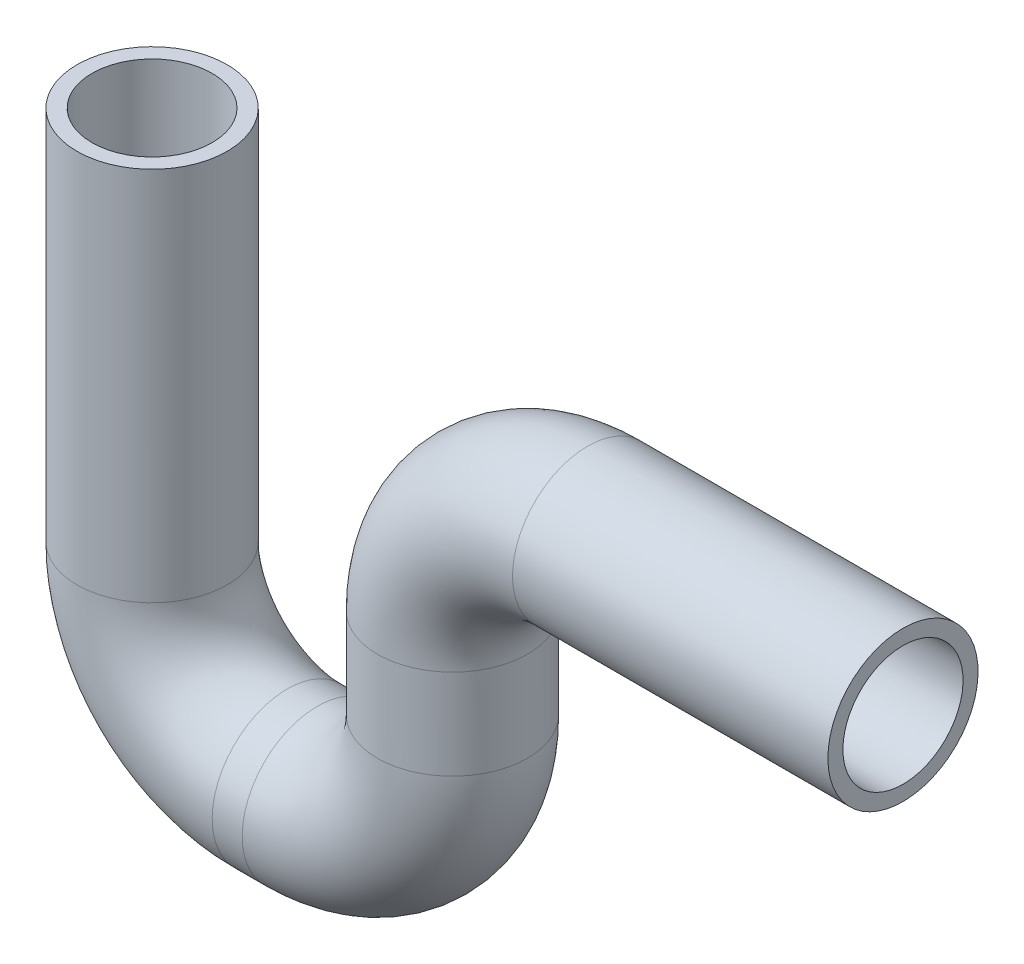
ISO-10303-21;
HEADER;
FILE_DESCRIPTION(('STEP AP214'),'2;1');
FILE_NAME('part.step','',(''),(''),'','','');
FILE_SCHEMA(('AUTOMOTIVE_DESIGN { 1 0 10303 214 1 1 1 1 }'));
ENDSEC;
DATA;
#1=APPLICATION_CONTEXT('core data for automotive mechanical design processes');
#2=APPLICATION_PROTOCOL_DEFINITION('international standard','automotive_design',2000,#1);
#3=PRODUCT_CONTEXT('',#1,'mechanical');
#4=PRODUCT('Part','Part','',(#3));
#5=PRODUCT_RELATED_PRODUCT_CATEGORY('part','',(#4));
#6=PRODUCT_DEFINITION_FORMATION('','',#4);
#7=PRODUCT_DEFINITION_CONTEXT('part definition',#1,'design');
#8=PRODUCT_DEFINITION('design','',#6,#7);
#9=PRODUCT_DEFINITION_SHAPE('','',#8);
#10=(LENGTH_UNIT() NAMED_UNIT(*) SI_UNIT(.MILLI.,.METRE.));
#11=(NAMED_UNIT(*) PLANE_ANGLE_UNIT() SI_UNIT($,.RADIAN.));
#12=(NAMED_UNIT(*) SI_UNIT($,.STERADIAN.) SOLID_ANGLE_UNIT());
#13=UNCERTAINTY_MEASURE_WITH_UNIT(LENGTH_MEASURE(1.E-05),#10,'distance_accuracy_value','');
#14=(GEOMETRIC_REPRESENTATION_CONTEXT(3) GLOBAL_UNCERTAINTY_ASSIGNED_CONTEXT((#13)) GLOBAL_UNIT_ASSIGNED_CONTEXT((#10,
#11,#12)) REPRESENTATION_CONTEXT('',''));
#15=CARTESIAN_POINT('',(0.,0.,0.));
#16=DIRECTION('',(0.,0.,1.));
#17=DIRECTION('',(1.,0.,0.));
#18=AXIS2_PLACEMENT_3D('',#15,#16,#17);
#19=CARTESIAN_POINT('',(0.,0.,0.));
#20=DIRECTION('',(0.,-1.,0.));
#21=DIRECTION('',(1.,0.,0.));
#22=AXIS2_PLACEMENT_3D('',#19,#20,#21);
#23=CYLINDRICAL_SURFACE('',#22,25.);
#24=CARTESIAN_POINT('',(0.,-125.,0.));
#25=DIRECTION('',(0.,1.,0.));
#26=DIRECTION('',(0.,0.,1.));
#27=AXIS2_PLACEMENT_3D('',#24,#25,#26);
#28=CIRCLE('',#27,25.);
#29=CARTESIAN_POINT('',(-25.,-125.,0.));
#30=VERTEX_POINT('',#29);
#31=EDGE_CURVE('E61',#30,#30,#28,.T.);
#32=ORIENTED_EDGE('',*,*,#31,.T.);
#33=EDGE_LOOP('',(#32));
#34=FACE_BOUND('',#33,.T.);
#35=CARTESIAN_POINT('',(0.,0.,0.));
#36=DIRECTION('',(0.,1.,0.));
#37=DIRECTION('',(0.,0.,1.));
#38=AXIS2_PLACEMENT_3D('',#35,#36,#37);
#39=CIRCLE('',#38,25.);
#40=CARTESIAN_POINT('',(0.,0.,25.));
#41=VERTEX_POINT('',#40);
#42=EDGE_CURVE('E58',#41,#41,#39,.T.);
#43=ORIENTED_EDGE('',*,*,#42,.F.);
#44=EDGE_LOOP('',(#43));
#45=FACE_BOUND('',#44,.T.);
#46=ADVANCED_FACE('F37',(#34,#45),#23,.T.);
#47=CARTESIAN_POINT('',(45.,-125.,0.));
#48=DIRECTION('',(0.,0.,1.));
#49=DIRECTION('',(1.,0.,0.));
#50=AXIS2_PLACEMENT_3D('',#47,#48,#49);
#51=TOROIDAL_SURFACE('',#50,45.,25.);
#52=CARTESIAN_POINT('',(45.,-170.,0.));
#53=DIRECTION('',(-1.,0.,0.));
#54=DIRECTION('',(0.,0.,1.));
#55=AXIS2_PLACEMENT_3D('',#52,#53,#54);
#56=CIRCLE('',#55,25.);
#57=CARTESIAN_POINT('',(45.,-195.,0.));
#58=VERTEX_POINT('',#57);
#59=EDGE_CURVE('E64',#58,#58,#56,.T.);
#60=CARTESIAN_POINT('',(45.,-125.,0.));
#61=DIRECTION('',(0.,0.,1.));
#62=DIRECTION('',(1.,0.,0.));
#63=AXIS2_PLACEMENT_3D('',#60,#61,#62);
#64=CIRCLE('',#63,70.);
#65=EDGE_CURVE('',#30,#58,#64,.T.);
#66=ORIENTED_EDGE('',*,*,#31,.F.);
#67=ORIENTED_EDGE('',*,*,#59,.T.);
#68=ORIENTED_EDGE('',*,*,#65,.T.);
#69=ORIENTED_EDGE('',*,*,#65,.F.);
#70=EDGE_LOOP('',(#66,#68,#67,#69));
#71=FACE_BOUND('',#70,.T.);
#72=ADVANCED_FACE('F112',(#71),#51,.T.);
#73=CARTESIAN_POINT('',(45.,-170.,0.));
#74=DIRECTION('',(1.,0.,0.));
#75=DIRECTION('',(0.,0.,-1.));
#76=AXIS2_PLACEMENT_3D('',#73,#74,#75);
#77=CYLINDRICAL_SURFACE('',#76,25.);
#78=CARTESIAN_POINT('',(55.,-170.,0.));
#79=DIRECTION('',(-1.,0.,0.));
#80=DIRECTION('',(0.,0.,1.));
#81=AXIS2_PLACEMENT_3D('',#78,#79,#80);
#82=CIRCLE('',#81,25.);
#83=CARTESIAN_POINT('',(55.,-195.,0.));
#84=VERTEX_POINT('',#83);
#85=EDGE_CURVE('E67',#84,#84,#82,.T.);
#86=ORIENTED_EDGE('',*,*,#85,.T.);
#87=EDGE_LOOP('',(#86));
#88=FACE_BOUND('',#87,.T.);
#89=ORIENTED_EDGE('',*,*,#59,.F.);
#90=EDGE_LOOP('',(#89));
#91=FACE_BOUND('',#90,.T.);
#92=ADVANCED_FACE('F116',(#88,#91),#77,.T.);
#93=CARTESIAN_POINT('',(55.,-125.,0.));
#94=DIRECTION('',(0.,0.,1.));
#95=DIRECTION('',(1.,0.,0.));
#96=AXIS2_PLACEMENT_3D('',#93,#94,#95);
#97=TOROIDAL_SURFACE('',#96,45.,25.);
#98=CARTESIAN_POINT('',(100.,-125.,0.));
#99=DIRECTION('',(0.,-1.,0.));
#100=DIRECTION('',(0.,0.,1.));
#101=AXIS2_PLACEMENT_3D('',#98,#99,#100);
#102=CIRCLE('',#101,25.);
#103=CARTESIAN_POINT('',(125.,-125.,0.));
#104=VERTEX_POINT('',#103);
#105=EDGE_CURVE('E70',#104,#104,#102,.T.);
#106=CARTESIAN_POINT('',(55.,-125.,0.));
#107=DIRECTION('',(0.,0.,1.));
#108=DIRECTION('',(1.,0.,0.));
#109=AXIS2_PLACEMENT_3D('',#106,#107,#108);
#110=CIRCLE('',#109,70.);
#111=EDGE_CURVE('',#84,#104,#110,.T.);
#112=ORIENTED_EDGE('',*,*,#85,.F.);
#113=ORIENTED_EDGE('',*,*,#105,.T.);
#114=ORIENTED_EDGE('',*,*,#111,.T.);
#115=ORIENTED_EDGE('',*,*,#111,.F.);
#116=EDGE_LOOP('',(#112,#114,#113,#115));
#117=FACE_BOUND('',#116,.T.);
#118=ADVANCED_FACE('F120',(#117),#97,.T.);
#119=CARTESIAN_POINT('',(100.,-125.,0.));
#120=DIRECTION('',(0.,1.,0.));
#121=DIRECTION('',(0.,0.,1.));
#122=AXIS2_PLACEMENT_3D('',#119,#120,#121);
#123=CYLINDRICAL_SURFACE('',#122,25.);
#124=CARTESIAN_POINT('',(100.,-95.,0.));
#125=DIRECTION('',(0.,-1.,0.));
#126=DIRECTION('',(0.,0.,1.));
#127=AXIS2_PLACEMENT_3D('',#124,#125,#126);
#128=CIRCLE('',#127,25.);
#129=CARTESIAN_POINT('',(75.,-95.,0.));
#130=VERTEX_POINT('',#129);
#131=EDGE_CURVE('E72',#130,#130,#128,.T.);
#132=ORIENTED_EDGE('',*,*,#131,.T.);
#133=EDGE_LOOP('',(#132));
#134=FACE_BOUND('',#133,.T.);
#135=ORIENTED_EDGE('',*,*,#105,.F.);
#136=EDGE_LOOP('',(#135));
#137=FACE_BOUND('',#136,.T.);
#138=ADVANCED_FACE('F92',(#134,#137),#123,.T.);
#139=CARTESIAN_POINT('',(145.,-95.,0.));
#140=DIRECTION('',(0.,0.,-1.));
#141=DIRECTION('',(-1.,0.,0.));
#142=AXIS2_PLACEMENT_3D('',#139,#140,#141);
#143=TOROIDAL_SURFACE('',#142,45.,25.);
#144=CARTESIAN_POINT('',(145.,-50.,0.));
#145=DIRECTION('',(-1.,0.,0.));
#146=DIRECTION('',(0.,0.,1.));
#147=AXIS2_PLACEMENT_3D('',#144,#145,#146);
#148=CIRCLE('',#147,25.);
#149=CARTESIAN_POINT('',(145.,-25.,0.));
#150=VERTEX_POINT('',#149);
#151=EDGE_CURVE('E41',#150,#150,#148,.T.);
#152=CARTESIAN_POINT('',(145.,-95.,0.));
#153=DIRECTION('',(0.,0.,-1.));
#154=DIRECTION('',(-1.,0.,0.));
#155=AXIS2_PLACEMENT_3D('',#152,#153,#154);
#156=CIRCLE('',#155,70.);
#157=EDGE_CURVE('',#130,#150,#156,.T.);
#158=ORIENTED_EDGE('',*,*,#131,.F.);
#159=ORIENTED_EDGE('',*,*,#151,.T.);
#160=ORIENTED_EDGE('',*,*,#157,.T.);
#161=ORIENTED_EDGE('',*,*,#157,.F.);
#162=EDGE_LOOP('',(#158,#160,#159,#161));
#163=FACE_BOUND('',#162,.T.);
#164=ADVANCED_FACE('F79',(#163),#143,.T.);
#165=CARTESIAN_POINT('',(145.,-50.,0.));
#166=DIRECTION('',(1.,0.,0.));
#167=DIRECTION('',(0.,0.,-1.));
#168=AXIS2_PLACEMENT_3D('',#165,#166,#167);
#169=CYLINDRICAL_SURFACE('',#168,25.);
#170=CARTESIAN_POINT('',(250.,-50.,0.));
#171=DIRECTION('',(-1.,0.,0.));
#172=DIRECTION('',(0.,0.,1.));
#173=AXIS2_PLACEMENT_3D('',#170,#171,#172);
#174=CIRCLE('',#173,25.);
#175=CARTESIAN_POINT('',(250.,-50.,25.));
#176=VERTEX_POINT('',#175);
#177=EDGE_CURVE('E54',#176,#176,#174,.T.);
#178=ORIENTED_EDGE('',*,*,#177,.T.);
#179=EDGE_LOOP('',(#178));
#180=FACE_BOUND('',#179,.T.);
#181=ORIENTED_EDGE('',*,*,#151,.F.);
#182=EDGE_LOOP('',(#181));
#183=FACE_BOUND('',#182,.T.);
#184=ADVANCED_FACE('F39',(#180,#183),#169,.T.);
#185=CARTESIAN_POINT('',(0.,0.,0.));
#186=DIRECTION('',(0.,1.,0.));
#187=DIRECTION('',(0.,0.,1.));
#188=AXIS2_PLACEMENT_3D('',#185,#186,#187);
#189=PLANE('',#188);
#190=CARTESIAN_POINT('',(0.,0.,0.));
#191=DIRECTION('',(0.,1.,0.));
#192=DIRECTION('',(0.,0.,1.));
#193=AXIS2_PLACEMENT_3D('',#190,#191,#192);
#194=CIRCLE('',#193,20.);
#195=CARTESIAN_POINT('',(0.,0.,20.));
#196=VERTEX_POINT('',#195);
#197=EDGE_CURVE('E57',#196,#196,#194,.F.);
#198=ORIENTED_EDGE('',*,*,#197,.T.);
#199=EDGE_LOOP('',(#198));
#200=FACE_BOUND('',#199,.T.);
#201=ORIENTED_EDGE('',*,*,#42,.T.);
#202=EDGE_LOOP('',(#201));
#203=FACE_BOUND('',#202,.T.);
#204=ADVANCED_FACE('F83',(#200,#203),#189,.T.);
#205=CARTESIAN_POINT('',(250.,-50.,0.));
#206=DIRECTION('',(-1.,0.,0.));
#207=DIRECTION('',(0.,0.,1.));
#208=AXIS2_PLACEMENT_3D('',#205,#206,#207);
#209=PLANE('',#208);
#210=CARTESIAN_POINT('',(250.,-50.,0.));
#211=DIRECTION('',(-1.,0.,0.));
#212=DIRECTION('',(0.,0.,1.));
#213=AXIS2_PLACEMENT_3D('',#210,#211,#212);
#214=CIRCLE('',#213,20.);
#215=CARTESIAN_POINT('',(250.,-50.,20.));
#216=VERTEX_POINT('',#215);
#217=EDGE_CURVE('E10',#216,#216,#214,.F.);
#218=ORIENTED_EDGE('',*,*,#217,.F.);
#219=EDGE_LOOP('',(#218));
#220=FACE_BOUND('',#219,.T.);
#221=ORIENTED_EDGE('',*,*,#177,.F.);
#222=EDGE_LOOP('',(#221));
#223=FACE_BOUND('',#222,.T.);
#224=ADVANCED_FACE('F89',(#220,#223),#209,.F.);
#225=CARTESIAN_POINT('',(0.,0.,0.));
#226=DIRECTION('',(0.,-1.,0.));
#227=DIRECTION('',(1.,0.,0.));
#228=AXIS2_PLACEMENT_3D('',#225,#226,#227);
#229=CYLINDRICAL_SURFACE('',#228,20.);
#230=CARTESIAN_POINT('',(0.,-125.,0.));
#231=DIRECTION('',(0.,1.,0.));
#232=DIRECTION('',(0.,0.,1.));
#233=AXIS2_PLACEMENT_3D('',#230,#231,#232);
#234=CIRCLE('',#233,20.);
#235=CARTESIAN_POINT('',(-20.,-125.,0.));
#236=VERTEX_POINT('',#235);
#237=EDGE_CURVE('E237',#236,#236,#234,.F.);
#238=ORIENTED_EDGE('',*,*,#237,.T.);
#239=EDGE_LOOP('',(#238));
#240=FACE_BOUND('',#239,.T.);
#241=ORIENTED_EDGE('',*,*,#197,.F.);
#242=EDGE_LOOP('',(#241));
#243=FACE_BOUND('',#242,.T.);
#244=ADVANCED_FACE('F107',(#240,#243),#229,.F.);
#245=CARTESIAN_POINT('',(45.,-125.,0.));
#246=DIRECTION('',(0.,0.,1.));
#247=DIRECTION('',(1.,0.,0.));
#248=AXIS2_PLACEMENT_3D('',#245,#246,#247);
#249=TOROIDAL_SURFACE('',#248,45.,20.);
#250=CARTESIAN_POINT('',(45.,-170.,0.));
#251=DIRECTION('',(-1.,0.,0.));
#252=DIRECTION('',(0.,0.,1.));
#253=AXIS2_PLACEMENT_3D('',#250,#251,#252);
#254=CIRCLE('',#253,20.);
#255=CARTESIAN_POINT('',(45.,-190.,0.));
#256=VERTEX_POINT('',#255);
#257=EDGE_CURVE('E232',#256,#256,#254,.F.);
#258=CARTESIAN_POINT('',(45.,-125.,0.));
#259=DIRECTION('',(0.,0.,1.));
#260=DIRECTION('',(1.,0.,0.));
#261=AXIS2_PLACEMENT_3D('',#258,#259,#260);
#262=CIRCLE('',#261,65.);
#263=EDGE_CURVE('',#236,#256,#262,.T.);
#264=ORIENTED_EDGE('',*,*,#237,.F.);
#265=ORIENTED_EDGE('',*,*,#257,.T.);
#266=ORIENTED_EDGE('',*,*,#263,.T.);
#267=ORIENTED_EDGE('',*,*,#263,.F.);
#268=EDGE_LOOP('',(#264,#266,#265,#267));
#269=FACE_BOUND('',#268,.T.);
#270=ADVANCED_FACE('F172',(#269),#249,.F.);
#271=CARTESIAN_POINT('',(45.,-170.,0.));
#272=DIRECTION('',(1.,0.,0.));
#273=DIRECTION('',(0.,0.,-1.));
#274=AXIS2_PLACEMENT_3D('',#271,#272,#273);
#275=CYLINDRICAL_SURFACE('',#274,20.);
#276=CARTESIAN_POINT('',(55.,-170.,0.));
#277=DIRECTION('',(-1.,0.,0.));
#278=DIRECTION('',(0.,0.,1.));
#279=AXIS2_PLACEMENT_3D('',#276,#277,#278);
#280=CIRCLE('',#279,20.);
#281=CARTESIAN_POINT('',(55.,-190.,0.));
#282=VERTEX_POINT('',#281);
#283=EDGE_CURVE('E229',#282,#282,#280,.F.);
#284=ORIENTED_EDGE('',*,*,#283,.T.);
#285=EDGE_LOOP('',(#284));
#286=FACE_BOUND('',#285,.T.);
#287=ORIENTED_EDGE('',*,*,#257,.F.);
#288=EDGE_LOOP('',(#287));
#289=FACE_BOUND('',#288,.T.);
#290=ADVANCED_FACE('F182',(#286,#289),#275,.F.);
#291=CARTESIAN_POINT('',(55.,-125.,0.));
#292=DIRECTION('',(0.,0.,1.));
#293=DIRECTION('',(1.,0.,0.));
#294=AXIS2_PLACEMENT_3D('',#291,#292,#293);
#295=TOROIDAL_SURFACE('',#294,45.,20.);
#296=CARTESIAN_POINT('',(100.,-125.,0.));
#297=DIRECTION('',(0.,-1.,0.));
#298=DIRECTION('',(0.,0.,1.));
#299=AXIS2_PLACEMENT_3D('',#296,#297,#298);
#300=CIRCLE('',#299,20.);
#301=CARTESIAN_POINT('',(120.,-125.,0.));
#302=VERTEX_POINT('',#301);
#303=EDGE_CURVE('E228',#302,#302,#300,.F.);
#304=CARTESIAN_POINT('',(55.,-125.,0.));
#305=DIRECTION('',(0.,0.,1.));
#306=DIRECTION('',(1.,0.,0.));
#307=AXIS2_PLACEMENT_3D('',#304,#305,#306);
#308=CIRCLE('',#307,65.);
#309=EDGE_CURVE('',#282,#302,#308,.T.);
#310=ORIENTED_EDGE('',*,*,#283,.F.);
#311=ORIENTED_EDGE('',*,*,#303,.T.);
#312=ORIENTED_EDGE('',*,*,#309,.T.);
#313=ORIENTED_EDGE('',*,*,#309,.F.);
#314=EDGE_LOOP('',(#310,#312,#311,#313));
#315=FACE_BOUND('',#314,.T.);
#316=ADVANCED_FACE('F192',(#315),#295,.F.);
#317=CARTESIAN_POINT('',(100.,-125.,0.));
#318=DIRECTION('',(0.,1.,0.));
#319=DIRECTION('',(0.,0.,1.));
#320=AXIS2_PLACEMENT_3D('',#317,#318,#319);
#321=CYLINDRICAL_SURFACE('',#320,20.);
#322=CARTESIAN_POINT('',(100.,-95.,0.));
#323=DIRECTION('',(0.,-1.,0.));
#324=DIRECTION('',(0.,0.,1.));
#325=AXIS2_PLACEMENT_3D('',#322,#323,#324);
#326=CIRCLE('',#325,20.);
#327=CARTESIAN_POINT('',(80.,-95.,0.));
#328=VERTEX_POINT('',#327);
#329=EDGE_CURVE('E50',#328,#328,#326,.F.);
#330=ORIENTED_EDGE('',*,*,#329,.T.);
#331=EDGE_LOOP('',(#330));
#332=FACE_BOUND('',#331,.T.);
#333=ORIENTED_EDGE('',*,*,#303,.F.);
#334=EDGE_LOOP('',(#333));
#335=FACE_BOUND('',#334,.T.);
#336=ADVANCED_FACE('F100',(#332,#335),#321,.F.);
#337=CARTESIAN_POINT('',(145.,-95.,0.));
#338=DIRECTION('',(0.,0.,-1.));
#339=DIRECTION('',(-1.,0.,0.));
#340=AXIS2_PLACEMENT_3D('',#337,#338,#339);
#341=TOROIDAL_SURFACE('',#340,45.,20.);
#342=CARTESIAN_POINT('',(145.,-50.,0.));
#343=DIRECTION('',(-1.,0.,0.));
#344=DIRECTION('',(0.,0.,1.));
#345=AXIS2_PLACEMENT_3D('',#342,#343,#344);
#346=CIRCLE('',#345,20.);
#347=CARTESIAN_POINT('',(145.,-30.,0.));
#348=VERTEX_POINT('',#347);
#349=EDGE_CURVE('E45',#348,#348,#346,.F.);
#350=CARTESIAN_POINT('',(145.,-95.,0.));
#351=DIRECTION('',(0.,0.,-1.));
#352=DIRECTION('',(-1.,0.,0.));
#353=AXIS2_PLACEMENT_3D('',#350,#351,#352);
#354=CIRCLE('',#353,65.);
#355=EDGE_CURVE('',#328,#348,#354,.T.);
#356=ORIENTED_EDGE('',*,*,#329,.F.);
#357=ORIENTED_EDGE('',*,*,#349,.T.);
#358=ORIENTED_EDGE('',*,*,#355,.T.);
#359=ORIENTED_EDGE('',*,*,#355,.F.);
#360=EDGE_LOOP('',(#356,#358,#357,#359));
#361=FACE_BOUND('',#360,.T.);
#362=ADVANCED_FACE('F95',(#361),#341,.F.);
#363=CARTESIAN_POINT('',(145.,-50.,0.));
#364=DIRECTION('',(1.,0.,0.));
#365=DIRECTION('',(0.,0.,-1.));
#366=AXIS2_PLACEMENT_3D('',#363,#364,#365);
#367=CYLINDRICAL_SURFACE('',#366,20.);
#368=ORIENTED_EDGE('',*,*,#217,.T.);
#369=EDGE_LOOP('',(#368));
#370=FACE_BOUND('',#369,.T.);
#371=ORIENTED_EDGE('',*,*,#349,.F.);
#372=EDGE_LOOP('',(#371));
#373=FACE_BOUND('',#372,.T.);
#374=ADVANCED_FACE('F93',(#370,#373),#367,.F.);
#375=CLOSED_SHELL('',(#46,#72,#92,#118,#138,#164,#184,#204,#224,#244,#270,#290,#316,#336,#362,#374));
#376=MANIFOLD_SOLID_BREP('B2',#375);
#377=ADVANCED_BREP_SHAPE_REPRESENTATION('',(#18,#376),#14);
#378=SHAPE_DEFINITION_REPRESENTATION(#9,#377);
ENDSEC;
END-ISO-10303-21;
